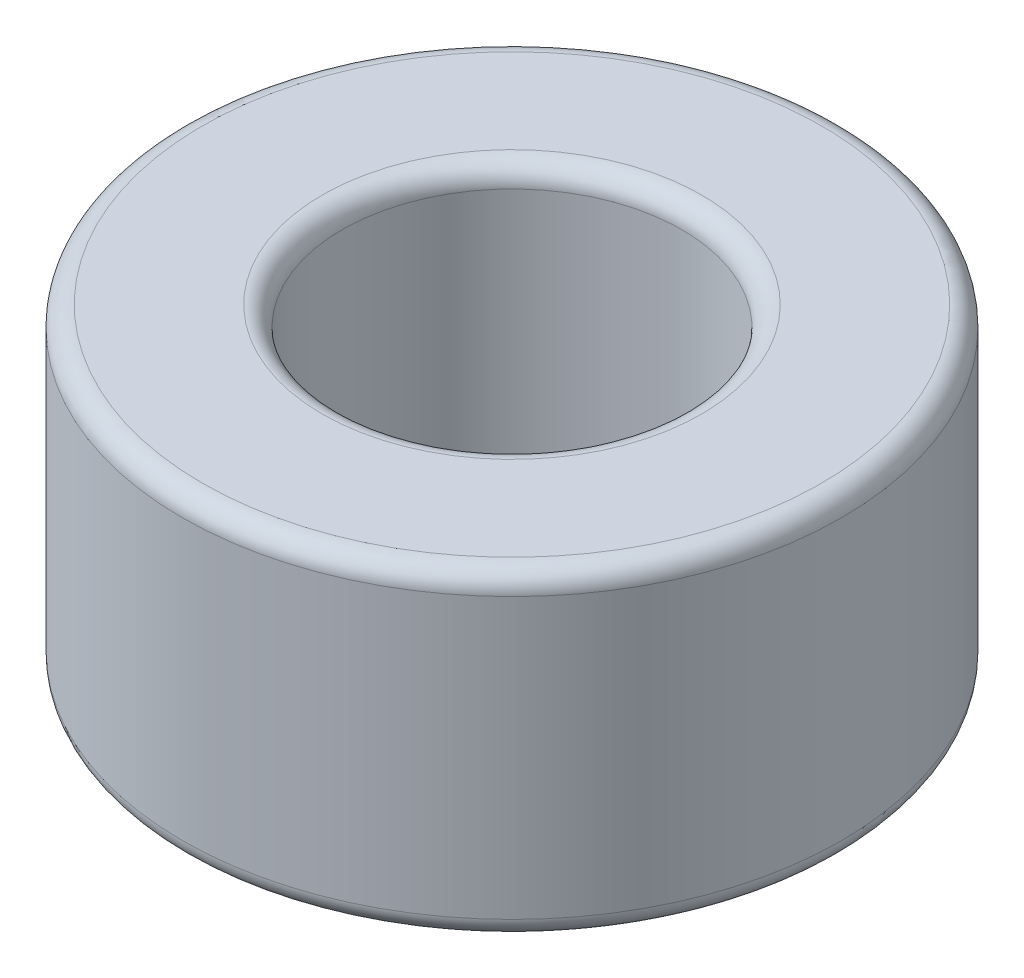
ISO-10303-21;
HEADER;
FILE_DESCRIPTION(('STEP AP214'),'2;1');
FILE_NAME('part.step','',(''),(''),'','','');
FILE_SCHEMA(('AUTOMOTIVE_DESIGN { 1 0 10303 214 1 1 1 1 }'));
ENDSEC;
DATA;
#1=APPLICATION_CONTEXT('core data for automotive mechanical design processes');
#2=APPLICATION_PROTOCOL_DEFINITION('international standard','automotive_design',2000,#1);
#3=PRODUCT_CONTEXT('',#1,'mechanical');
#4=PRODUCT('Part','Part','',(#3));
#5=PRODUCT_RELATED_PRODUCT_CATEGORY('part','',(#4));
#6=PRODUCT_DEFINITION_FORMATION('','',#4);
#7=PRODUCT_DEFINITION_CONTEXT('part definition',#1,'design');
#8=PRODUCT_DEFINITION('design','',#6,#7);
#9=PRODUCT_DEFINITION_SHAPE('','',#8);
#10=(LENGTH_UNIT() NAMED_UNIT(*) SI_UNIT(.MILLI.,.METRE.));
#11=(NAMED_UNIT(*) PLANE_ANGLE_UNIT() SI_UNIT($,.RADIAN.));
#12=(NAMED_UNIT(*) SI_UNIT($,.STERADIAN.) SOLID_ANGLE_UNIT());
#13=UNCERTAINTY_MEASURE_WITH_UNIT(LENGTH_MEASURE(1.E-05),#10,'distance_accuracy_value','');
#14=(GEOMETRIC_REPRESENTATION_CONTEXT(3) GLOBAL_UNCERTAINTY_ASSIGNED_CONTEXT((#13)) GLOBAL_UNIT_ASSIGNED_CONTEXT((#10,
#11,#12)) REPRESENTATION_CONTEXT('',''));
#15=CARTESIAN_POINT('',(0.,0.,0.));
#16=DIRECTION('',(0.,0.,1.));
#17=DIRECTION('',(1.,0.,0.));
#18=AXIS2_PLACEMENT_3D('',#15,#16,#17);
#19=CARTESIAN_POINT('',(0.,8.,0.));
#20=DIRECTION('',(0.,1.,0.));
#21=DIRECTION('',(0.,0.,1.));
#22=AXIS2_PLACEMENT_3D('',#19,#20,#21);
#23=PLANE('',#22);
#24=CARTESIAN_POINT('',(0.,8.,0.));
#25=DIRECTION('',(0.,1.,0.));
#26=DIRECTION('',(0.,0.,1.));
#27=AXIS2_PLACEMENT_3D('',#24,#25,#26);
#28=CIRCLE('',#27,7.75);
#29=CARTESIAN_POINT('',(0.,8.,7.75));
#30=VERTEX_POINT('',#29);
#31=EDGE_CURVE('E10',#30,#30,#28,.T.);
#32=ORIENTED_EDGE('',*,*,#31,.T.);
#33=EDGE_LOOP('',(#32));
#34=FACE_BOUND('',#33,.T.);
#35=CARTESIAN_POINT('',(0.,8.,0.));
#36=DIRECTION('',(0.,1.,0.));
#37=DIRECTION('',(0.,0.,1.));
#38=AXIS2_PLACEMENT_3D('',#35,#36,#37);
#39=CIRCLE('',#38,4.75);
#40=CARTESIAN_POINT('',(0.,8.,4.75));
#41=VERTEX_POINT('',#40);
#42=EDGE_CURVE('E39',#41,#41,#39,.F.);
#43=ORIENTED_EDGE('',*,*,#42,.T.);
#44=EDGE_LOOP('',(#43));
#45=FACE_BOUND('',#44,.T.);
#46=ADVANCED_FACE('F32',(#34,#45),#23,.T.);
#47=CARTESIAN_POINT('',(0.,0.,0.));
#48=DIRECTION('',(0.,1.,0.));
#49=DIRECTION('',(0.,0.,1.));
#50=AXIS2_PLACEMENT_3D('',#47,#48,#49);
#51=PLANE('',#50);
#52=CARTESIAN_POINT('',(0.,0.,0.));
#53=DIRECTION('',(0.,1.,0.));
#54=DIRECTION('',(0.,0.,1.));
#55=AXIS2_PLACEMENT_3D('',#52,#53,#54);
#56=CIRCLE('',#55,7.75);
#57=CARTESIAN_POINT('',(0.,0.,7.75));
#58=VERTEX_POINT('',#57);
#59=EDGE_CURVE('E52',#58,#58,#56,.F.);
#60=ORIENTED_EDGE('',*,*,#59,.T.);
#61=EDGE_LOOP('',(#60));
#62=FACE_BOUND('',#61,.T.);
#63=CARTESIAN_POINT('',(0.,0.,0.));
#64=DIRECTION('',(0.,1.,0.));
#65=DIRECTION('',(0.,0.,1.));
#66=AXIS2_PLACEMENT_3D('',#63,#64,#65);
#67=CIRCLE('',#66,4.75);
#68=CARTESIAN_POINT('',(0.,0.,4.75));
#69=VERTEX_POINT('',#68);
#70=EDGE_CURVE('E55',#69,#69,#67,.T.);
#71=ORIENTED_EDGE('',*,*,#70,.T.);
#72=EDGE_LOOP('',(#71));
#73=FACE_BOUND('',#72,.T.);
#74=ADVANCED_FACE('F80',(#62,#73),#51,.F.);
#75=CARTESIAN_POINT('',(0.,8.,0.));
#76=DIRECTION('',(0.,-1.,0.));
#77=DIRECTION('',(0.,0.,-1.));
#78=AXIS2_PLACEMENT_3D('',#75,#76,#77);
#79=CYLINDRICAL_SURFACE('',#78,8.25);
#80=CARTESIAN_POINT('',(0.,0.5,0.));
#81=DIRECTION('',(0.,1.,0.));
#82=DIRECTION('',(0.,0.,1.));
#83=AXIS2_PLACEMENT_3D('',#80,#81,#82);
#84=CIRCLE('',#83,8.25);
#85=CARTESIAN_POINT('',(0.,0.5,8.25));
#86=VERTEX_POINT('',#85);
#87=EDGE_CURVE('E58',#86,#86,#84,.T.);
#88=ORIENTED_EDGE('',*,*,#87,.T.);
#89=EDGE_LOOP('',(#88));
#90=FACE_BOUND('',#89,.T.);
#91=CARTESIAN_POINT('',(0.,7.5,0.));
#92=DIRECTION('',(0.,1.,0.));
#93=DIRECTION('',(0.,0.,1.));
#94=AXIS2_PLACEMENT_3D('',#91,#92,#93);
#95=CIRCLE('',#94,8.25);
#96=CARTESIAN_POINT('',(0.,7.5,8.25));
#97=VERTEX_POINT('',#96);
#98=EDGE_CURVE('E61',#97,#97,#95,.F.);
#99=ORIENTED_EDGE('',*,*,#98,.T.);
#100=EDGE_LOOP('',(#99));
#101=FACE_BOUND('',#100,.T.);
#102=ADVANCED_FACE('F65',(#90,#101),#79,.T.);
#103=CARTESIAN_POINT('',(0.,8.,0.));
#104=DIRECTION('',(0.,-1.,0.));
#105=DIRECTION('',(0.,0.,-1.));
#106=AXIS2_PLACEMENT_3D('',#103,#104,#105);
#107=CYLINDRICAL_SURFACE('',#106,4.25);
#108=CARTESIAN_POINT('',(0.,0.5,0.));
#109=DIRECTION('',(0.,1.,0.));
#110=DIRECTION('',(0.,0.,1.));
#111=AXIS2_PLACEMENT_3D('',#108,#109,#110);
#112=CIRCLE('',#111,4.25);
#113=CARTESIAN_POINT('',(0.,0.5,4.25));
#114=VERTEX_POINT('',#113);
#115=EDGE_CURVE('E43',#114,#114,#112,.F.);
#116=ORIENTED_EDGE('',*,*,#115,.T.);
#117=EDGE_LOOP('',(#116));
#118=FACE_BOUND('',#117,.T.);
#119=CARTESIAN_POINT('',(0.,7.5,0.));
#120=DIRECTION('',(0.,1.,0.));
#121=DIRECTION('',(0.,0.,1.));
#122=AXIS2_PLACEMENT_3D('',#119,#120,#121);
#123=CIRCLE('',#122,4.25);
#124=CARTESIAN_POINT('',(0.,7.5,4.25));
#125=VERTEX_POINT('',#124);
#126=EDGE_CURVE('E47',#125,#125,#123,.T.);
#127=ORIENTED_EDGE('',*,*,#126,.T.);
#128=EDGE_LOOP('',(#127));
#129=FACE_BOUND('',#128,.T.);
#130=ADVANCED_FACE('F88',(#118,#129),#107,.F.);
#131=CARTESIAN_POINT('',(0.,0.5,0.));
#132=DIRECTION('',(0.,1.,0.));
#133=DIRECTION('',(0.,0.,1.));
#134=AXIS2_PLACEMENT_3D('',#131,#132,#133);
#135=TOROIDAL_SURFACE('',#134,7.75,0.5);
#136=ORIENTED_EDGE('',*,*,#59,.F.);
#137=EDGE_LOOP('',(#136));
#138=FACE_BOUND('',#137,.T.);
#139=ORIENTED_EDGE('',*,*,#87,.F.);
#140=EDGE_LOOP('',(#139));
#141=FACE_BOUND('',#140,.T.);
#142=ADVANCED_FACE('F76',(#138,#141),#135,.T.);
#143=CARTESIAN_POINT('',(0.,0.5,0.));
#144=DIRECTION('',(0.,1.,0.));
#145=DIRECTION('',(0.,0.,1.));
#146=AXIS2_PLACEMENT_3D('',#143,#144,#145);
#147=TOROIDAL_SURFACE('',#146,4.75,0.5);
#148=ORIENTED_EDGE('',*,*,#115,.F.);
#149=EDGE_LOOP('',(#148));
#150=FACE_BOUND('',#149,.T.);
#151=ORIENTED_EDGE('',*,*,#70,.F.);
#152=EDGE_LOOP('',(#151));
#153=FACE_BOUND('',#152,.T.);
#154=ADVANCED_FACE('F70',(#150,#153),#147,.T.);
#155=CARTESIAN_POINT('',(0.,7.5,0.));
#156=DIRECTION('',(0.,1.,0.));
#157=DIRECTION('',(0.,0.,1.));
#158=AXIS2_PLACEMENT_3D('',#155,#156,#157);
#159=TOROIDAL_SURFACE('',#158,7.75,0.5);
#160=ORIENTED_EDGE('',*,*,#98,.F.);
#161=EDGE_LOOP('',(#160));
#162=FACE_BOUND('',#161,.T.);
#163=ORIENTED_EDGE('',*,*,#31,.F.);
#164=EDGE_LOOP('',(#163));
#165=FACE_BOUND('',#164,.T.);
#166=ADVANCED_FACE('F67',(#162,#165),#159,.T.);
#167=CARTESIAN_POINT('',(0.,7.5,0.));
#168=DIRECTION('',(0.,1.,0.));
#169=DIRECTION('',(0.,0.,1.));
#170=AXIS2_PLACEMENT_3D('',#167,#168,#169);
#171=TOROIDAL_SURFACE('',#170,4.75,0.5);
#172=ORIENTED_EDGE('',*,*,#42,.F.);
#173=EDGE_LOOP('',(#172));
#174=FACE_BOUND('',#173,.T.);
#175=ORIENTED_EDGE('',*,*,#126,.F.);
#176=EDGE_LOOP('',(#175));
#177=FACE_BOUND('',#176,.T.);
#178=ADVANCED_FACE('F34',(#174,#177),#171,.T.);
#179=CLOSED_SHELL('',(#46,#74,#102,#130,#142,#154,#166,#178));
#180=MANIFOLD_SOLID_BREP('B2',#179);
#181=ADVANCED_BREP_SHAPE_REPRESENTATION('',(#18,#180),#14);
#182=SHAPE_DEFINITION_REPRESENTATION(#9,#181);
ENDSEC;
END-ISO-10303-21;
